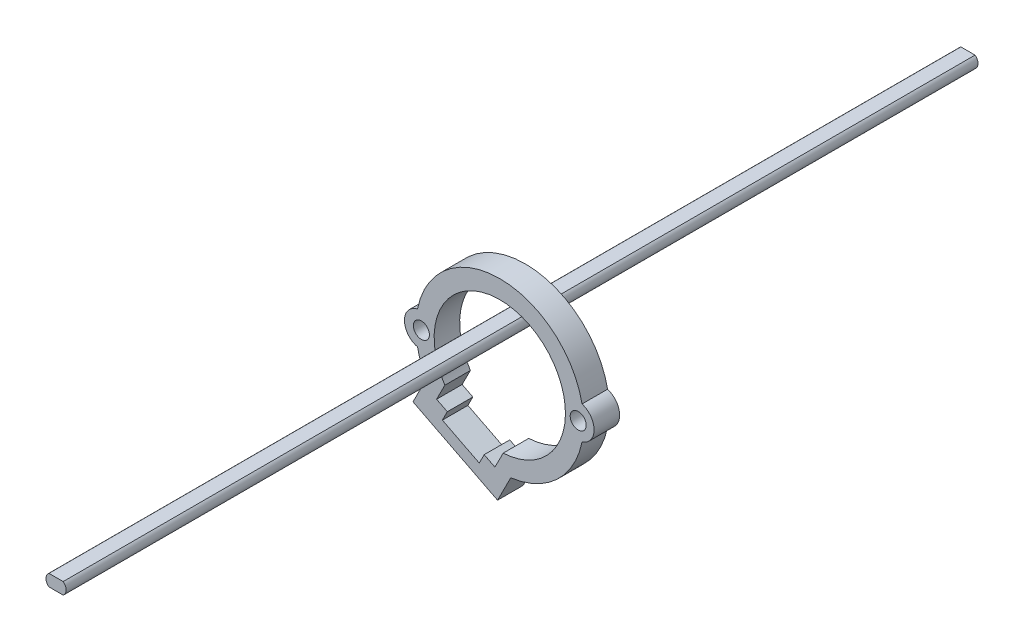
ISO-10303-21;
HEADER;
FILE_DESCRIPTION(('STEP AP214'),'2;1');
FILE_NAME('part.step','',(''),(''),'','','');
FILE_SCHEMA(('AUTOMOTIVE_DESIGN { 1 0 10303 214 1 1 1 1 }'));
ENDSEC;
DATA;
#1=APPLICATION_CONTEXT('core data for automotive mechanical design processes');
#2=APPLICATION_PROTOCOL_DEFINITION('international standard','automotive_design',2000,#1);
#3=PRODUCT_CONTEXT('',#1,'mechanical');
#4=PRODUCT('Part','Part','',(#3));
#5=PRODUCT_RELATED_PRODUCT_CATEGORY('part','',(#4));
#6=PRODUCT_DEFINITION_FORMATION('','',#4);
#7=PRODUCT_DEFINITION_CONTEXT('part definition',#1,'design');
#8=PRODUCT_DEFINITION('design','',#6,#7);
#9=PRODUCT_DEFINITION_SHAPE('','',#8);
#10=(LENGTH_UNIT() NAMED_UNIT(*) SI_UNIT(.MILLI.,.METRE.));
#11=(NAMED_UNIT(*) PLANE_ANGLE_UNIT() SI_UNIT($,.RADIAN.));
#12=(NAMED_UNIT(*) SI_UNIT($,.STERADIAN.) SOLID_ANGLE_UNIT());
#13=UNCERTAINTY_MEASURE_WITH_UNIT(LENGTH_MEASURE(1.E-05),#10,'distance_accuracy_value','');
#14=(GEOMETRIC_REPRESENTATION_CONTEXT(3) GLOBAL_UNCERTAINTY_ASSIGNED_CONTEXT((#13)) GLOBAL_UNIT_ASSIGNED_CONTEXT((#10,
#11,#12)) REPRESENTATION_CONTEXT('',''));
#15=CARTESIAN_POINT('',(0.,0.,0.));
#16=DIRECTION('',(0.,0.,1.));
#17=DIRECTION('',(1.,0.,0.));
#18=AXIS2_PLACEMENT_3D('',#15,#16,#17);
#19=CARTESIAN_POINT('',(-4.4134503803043,7.6,125.));
#20=DIRECTION('',(0.,0.,-1.));
#21=DIRECTION('',(-1.,0.,0.));
#22=AXIS2_PLACEMENT_3D('',#19,#20,#21);
#23=CYLINDRICAL_SURFACE('',#22,2.);
#24=CARTESIAN_POINT('',(-4.4134503803043,7.6,-125.));
#25=DIRECTION('',(0.,0.,1.));
#26=DIRECTION('',(1.,0.,0.));
#27=AXIS2_PLACEMENT_3D('',#24,#25,#26);
#28=CIRCLE('',#27,2.);
#29=CARTESIAN_POINT('',(-5.6,9.21,-125.));
#30=VERTEX_POINT('',#29);
#31=CARTESIAN_POINT('',(-5.6,5.99,-125.));
#32=VERTEX_POINT('',#31);
#33=EDGE_CURVE('E110',#30,#32,#28,.T.);
#34=ORIENTED_EDGE('',*,*,#33,.T.);
#35=DIRECTION('',(0.,0.,-1.));
#36=VECTOR('',#35,1.);
#37=CARTESIAN_POINT('',(-5.6,5.99,125.));
#38=LINE('',#37,#36);
#39=CARTESIAN_POINT('',(-5.6,5.99,125.));
#40=VERTEX_POINT('',#39);
#41=EDGE_CURVE('E12',#40,#32,#38,.T.);
#42=ORIENTED_EDGE('',*,*,#41,.F.);
#43=CARTESIAN_POINT('',(-4.4134503803043,7.6,125.));
#44=DIRECTION('',(0.,0.,1.));
#45=DIRECTION('',(1.,0.,0.));
#46=AXIS2_PLACEMENT_3D('',#43,#44,#45);
#47=CIRCLE('',#46,2.);
#48=CARTESIAN_POINT('',(-5.6,9.21,125.));
#49=VERTEX_POINT('',#48);
#50=EDGE_CURVE('E98',#49,#40,#47,.T.);
#51=ORIENTED_EDGE('',*,*,#50,.F.);
#52=DIRECTION('',(0.,0.,-1.));
#53=VECTOR('',#52,1.);
#54=CARTESIAN_POINT('',(-5.6,9.21,125.));
#55=LINE('',#54,#53);
#56=EDGE_CURVE('E106',#49,#30,#55,.T.);
#57=ORIENTED_EDGE('',*,*,#56,.T.);
#58=EDGE_LOOP('',(#34,#42,#51,#57));
#59=FACE_BOUND('',#58,.T.);
#60=ADVANCED_FACE('F47',(#59),#23,.T.);
#61=CARTESIAN_POINT('',(-1.7,5.99,125.));
#62=DIRECTION('',(0.,1.,0.));
#63=DIRECTION('',(-1.,0.,0.));
#64=AXIS2_PLACEMENT_3D('',#61,#62,#63);
#65=PLANE('',#64);
#66=DIRECTION('',(1.,0.,0.));
#67=VECTOR('',#66,1.);
#68=CARTESIAN_POINT('',(-1.7,5.99,-125.));
#69=LINE('',#68,#67);
#70=CARTESIAN_POINT('',(-1.7,5.99,-125.));
#71=VERTEX_POINT('',#70);
#72=EDGE_CURVE('E102',#32,#71,#69,.T.);
#73=ORIENTED_EDGE('',*,*,#72,.T.);
#74=DIRECTION('',(0.,0.,-1.));
#75=VECTOR('',#74,1.);
#76=CARTESIAN_POINT('',(-1.7,5.99,125.));
#77=LINE('',#76,#75);
#78=CARTESIAN_POINT('',(-1.7,5.99,125.));
#79=VERTEX_POINT('',#78);
#80=EDGE_CURVE('E55',#79,#71,#77,.T.);
#81=ORIENTED_EDGE('',*,*,#80,.F.);
#82=DIRECTION('',(1.,0.,0.));
#83=VECTOR('',#82,1.);
#84=CARTESIAN_POINT('',(-1.7,5.99,125.));
#85=LINE('',#84,#83);
#86=EDGE_CURVE('E93',#40,#79,#85,.T.);
#87=ORIENTED_EDGE('',*,*,#86,.F.);
#88=ORIENTED_EDGE('',*,*,#41,.T.);
#89=EDGE_LOOP('',(#73,#81,#87,#88));
#90=FACE_BOUND('',#89,.T.);
#91=ADVANCED_FACE('F101',(#90),#65,.F.);
#92=CARTESIAN_POINT('',(-2.8865496196957,7.6,125.));
#93=DIRECTION('',(0.,0.,-1.));
#94=DIRECTION('',(-1.,0.,0.));
#95=AXIS2_PLACEMENT_3D('',#92,#93,#94);
#96=CYLINDRICAL_SURFACE('',#95,2.);
#97=CARTESIAN_POINT('',(-2.8865496196957,7.6,-125.));
#98=DIRECTION('',(0.,0.,1.));
#99=DIRECTION('',(-1.,0.,0.));
#100=AXIS2_PLACEMENT_3D('',#97,#98,#99);
#101=CIRCLE('',#100,2.);
#102=CARTESIAN_POINT('',(-1.7,9.21,-125.));
#103=VERTEX_POINT('',#102);
#104=EDGE_CURVE('E80',#71,#103,#101,.T.);
#105=ORIENTED_EDGE('',*,*,#104,.T.);
#106=DIRECTION('',(0.,0.,-1.));
#107=VECTOR('',#106,1.);
#108=CARTESIAN_POINT('',(-1.7,9.21,125.));
#109=LINE('',#108,#107);
#110=CARTESIAN_POINT('',(-1.7,9.21,125.));
#111=VERTEX_POINT('',#110);
#112=EDGE_CURVE('E103',#111,#103,#109,.T.);
#113=ORIENTED_EDGE('',*,*,#112,.F.);
#114=CARTESIAN_POINT('',(-2.8865496196957,7.6,125.));
#115=DIRECTION('',(0.,0.,1.));
#116=DIRECTION('',(-1.,0.,0.));
#117=AXIS2_PLACEMENT_3D('',#114,#115,#116);
#118=CIRCLE('',#117,2.);
#119=EDGE_CURVE('E96',#79,#111,#118,.T.);
#120=ORIENTED_EDGE('',*,*,#119,.F.);
#121=ORIENTED_EDGE('',*,*,#80,.T.);
#122=EDGE_LOOP('',(#105,#113,#120,#121));
#123=FACE_BOUND('',#122,.T.);
#124=ADVANCED_FACE('F104',(#123),#96,.T.);
#125=CARTESIAN_POINT('',(-5.6,9.21,125.));
#126=DIRECTION('',(0.,-1.,0.));
#127=DIRECTION('',(1.,0.,0.));
#128=AXIS2_PLACEMENT_3D('',#125,#126,#127);
#129=PLANE('',#128);
#130=DIRECTION('',(-1.,0.,0.));
#131=VECTOR('',#130,1.);
#132=CARTESIAN_POINT('',(-5.6,9.21,-125.));
#133=LINE('',#132,#131);
#134=EDGE_CURVE('E86',#103,#30,#133,.T.);
#135=ORIENTED_EDGE('',*,*,#134,.T.);
#136=ORIENTED_EDGE('',*,*,#56,.F.);
#137=DIRECTION('',(-1.,0.,0.));
#138=VECTOR('',#137,1.);
#139=CARTESIAN_POINT('',(-5.6,9.21,125.));
#140=LINE('',#139,#138);
#141=EDGE_CURVE('E63',#111,#49,#140,.T.);
#142=ORIENTED_EDGE('',*,*,#141,.F.);
#143=ORIENTED_EDGE('',*,*,#112,.T.);
#144=EDGE_LOOP('',(#135,#136,#142,#143));
#145=FACE_BOUND('',#144,.T.);
#146=ADVANCED_FACE('F117',(#145),#129,.F.);
#147=CARTESIAN_POINT('',(-4.4134503803043,7.6,125.));
#148=DIRECTION('',(0.,0.,1.));
#149=DIRECTION('',(1.,0.,0.));
#150=AXIS2_PLACEMENT_3D('',#147,#148,#149);
#151=PLANE('',#150);
#152=ORIENTED_EDGE('',*,*,#50,.T.);
#153=ORIENTED_EDGE('',*,*,#86,.T.);
#154=ORIENTED_EDGE('',*,*,#119,.T.);
#155=ORIENTED_EDGE('',*,*,#141,.T.);
#156=EDGE_LOOP('',(#152,#153,#154,#155));
#157=FACE_BOUND('',#156,.T.);
#158=ADVANCED_FACE('F94',(#157),#151,.T.);
#159=CARTESIAN_POINT('',(-4.4134503803043,7.6,-125.));
#160=DIRECTION('',(0.,0.,1.));
#161=DIRECTION('',(1.,0.,0.));
#162=AXIS2_PLACEMENT_3D('',#159,#160,#161);
#163=PLANE('',#162);
#164=ORIENTED_EDGE('',*,*,#33,.F.);
#165=ORIENTED_EDGE('',*,*,#134,.F.);
#166=ORIENTED_EDGE('',*,*,#104,.F.);
#167=ORIENTED_EDGE('',*,*,#72,.F.);
#168=EDGE_LOOP('',(#164,#165,#166,#167));
#169=FACE_BOUND('',#168,.T.);
#170=ADVANCED_FACE('F120',(#169),#163,.F.);
#171=CLOSED_SHELL('',(#60,#91,#124,#146,#158,#170));
#172=MANIFOLD_SOLID_BREP('B2',#171);
#173=CARTESIAN_POINT('',(0.,0.,7.));
#174=DIRECTION('',(0.,0.,1.));
#175=DIRECTION('',(1.,0.,0.));
#176=AXIS2_PLACEMENT_3D('',#173,#174,#175);
#177=PLANE('',#176);
#178=CARTESIAN_POINT('',(-21.5,0.,7.));
#179=DIRECTION('',(0.,0.,1.));
#180=DIRECTION('',(1.,0.,0.));
#181=AXIS2_PLACEMENT_3D('',#178,#179,#180);
#182=CIRCLE('',#181,2.2);
#183=CARTESIAN_POINT('',(-19.3,0.,7.));
#184=VERTEX_POINT('',#183);
#185=EDGE_CURVE('E321',#184,#184,#182,.T.);
#186=ORIENTED_EDGE('',*,*,#185,.F.);
#187=EDGE_LOOP('',(#186));
#188=FACE_BOUND('',#187,.T.);
#189=CARTESIAN_POINT('',(21.5,0.,7.));
#190=DIRECTION('',(0.,0.,1.));
#191=DIRECTION('',(1.,0.,0.));
#192=AXIS2_PLACEMENT_3D('',#189,#190,#191);
#193=CIRCLE('',#192,2.2);
#194=CARTESIAN_POINT('',(23.7,0.,7.));
#195=VERTEX_POINT('',#194);
#196=EDGE_CURVE('E328',#195,#195,#193,.T.);
#197=ORIENTED_EDGE('',*,*,#196,.F.);
#198=EDGE_LOOP('',(#197));
#199=FACE_BOUND('',#198,.T.);
#200=CARTESIAN_POINT('',(0.,0.,7.));
#201=DIRECTION('',(0.,0.,1.));
#202=DIRECTION('',(1.,0.,0.));
#203=AXIS2_PLACEMENT_3D('',#200,#201,#202);
#204=CIRCLE('',#203,23.);
#205=CARTESIAN_POINT('',(3.0037414094748,-22.8030159747566,7.));
#206=VERTEX_POINT('',#205);
#207=CARTESIAN_POINT('',(22.5554871372799,-4.49999999999999,7.));
#208=VERTEX_POINT('',#207);
#209=EDGE_CURVE('E45',#206,#208,#204,.T.);
#210=ORIENTED_EDGE('',*,*,#209,.T.);
#211=CARTESIAN_POINT('',(21.1440867670861,0.,7.));
#212=DIRECTION('',(0.,0.,1.));
#213=DIRECTION('',(1.,0.,0.));
#214=AXIS2_PLACEMENT_3D('',#211,#212,#213);
#215=CIRCLE('',#214,4.71614789897257);
#216=CARTESIAN_POINT('',(22.5554871372799,4.49999999999999,7.));
#217=VERTEX_POINT('',#216);
#218=EDGE_CURVE('E333',#208,#217,#215,.T.);
#219=ORIENTED_EDGE('',*,*,#218,.T.);
#220=CARTESIAN_POINT('',(-22.5554871372799,4.5,7.));
#221=VERTEX_POINT('',#220);
#222=EDGE_CURVE('E180',#217,#221,#204,.T.);
#223=ORIENTED_EDGE('',*,*,#222,.T.);
#224=CARTESIAN_POINT('',(-21.5191181486277,0.,7.));
#225=DIRECTION('',(0.,0.,1.));
#226=DIRECTION('',(-1.,0.,0.));
#227=AXIS2_PLACEMENT_3D('',#224,#225,#226);
#228=CIRCLE('',#227,4.61779825031801);
#229=CARTESIAN_POINT('',(-22.5554871372799,-4.5,7.));
#230=VERTEX_POINT('',#229);
#231=EDGE_CURVE('E343',#221,#230,#228,.T.);
#232=ORIENTED_EDGE('',*,*,#231,.T.);
#233=CARTESIAN_POINT('',(-20.1802691852822,-11.0343434607389,7.));
#234=VERTEX_POINT('',#233);
#235=EDGE_CURVE('E181',#230,#234,#204,.T.);
#236=ORIENTED_EDGE('',*,*,#235,.T.);
#237=DIRECTION('',(-0.452641250539145,-0.89169271518296,0.));
#238=VECTOR('',#237,1.);
#239=CARTESIAN_POINT('',(-23.8013991895953,-18.1678851822026,7.));
#240=LINE('',#239,#238);
#241=CARTESIAN_POINT('',(-23.8013991895953,-18.1678851822026,7.));
#242=VERTEX_POINT('',#241);
#243=EDGE_CURVE('E382',#234,#242,#240,.T.);
#244=ORIENTED_EDGE('',*,*,#243,.T.);
#245=DIRECTION('',(0.89169271518296,-0.452641250539144,0.));
#246=VECTOR('',#245,1.);
#247=CARTESIAN_POINT('',(-23.8013991895953,-18.1678851822026,7.));
#248=LINE('',#247,#246);
#249=CARTESIAN_POINT('',(-0.617388594838357,-29.9365576962203,7.));
#250=VERTEX_POINT('',#249);
#251=EDGE_CURVE('E385',#242,#250,#248,.T.);
#252=ORIENTED_EDGE('',*,*,#251,.T.);
#253=DIRECTION('',(0.452641250539144,0.89169271518296,0.));
#254=VECTOR('',#253,1.);
#255=CARTESIAN_POINT('',(-0.617388594838357,-29.9365576962203,7.));
#256=LINE('',#255,#254);
#257=EDGE_CURVE('E388',#250,#206,#256,.T.);
#258=ORIENTED_EDGE('',*,*,#257,.T.);
#259=EDGE_LOOP('',(#210,#219,#223,#232,#236,#244,#252,#258));
#260=FACE_BOUND('',#259,.T.);
#261=DIRECTION('',(0.89169271518296,-0.452641250539144,0.));
#262=VECTOR('',#261,1.);
#263=CARTESIAN_POINT('',(-5.6290336746241,-23.6155416865999,7.));
#264=LINE('',#263,#262);
#265=CARTESIAN_POINT('',(-15.7408290647989,-18.4825899054861,7.));
#266=VERTEX_POINT('',#265);
#267=CARTESIAN_POINT('',(-5.6290336746241,-23.6155416865999,7.));
#268=VERTEX_POINT('',#267);
#269=EDGE_CURVE('E298',#266,#268,#264,.T.);
#270=ORIENTED_EDGE('',*,*,#269,.F.);
#271=DIRECTION('',(-0.452641250539142,-0.891692715182961,0.));
#272=VECTOR('',#271,1.);
#273=CARTESIAN_POINT('',(-15.7408290647989,-18.4825899054861,7.));
#274=LINE('',#273,#272);
#275=CARTESIAN_POINT('',(-14.3829053131814,-15.8075117599372,7.));
#276=VERTEX_POINT('',#275);
#277=EDGE_CURVE('E287',#276,#266,#274,.T.);
#278=ORIENTED_EDGE('',*,*,#277,.F.);
#279=DIRECTION('',(0.89169271518296,-0.452641250539144,0.));
#280=VECTOR('',#279,1.);
#281=CARTESIAN_POINT('',(-17.3254912732852,-14.313795633158,7.));
#282=LINE('',#281,#280);
#283=CARTESIAN_POINT('',(-17.3254912732852,-14.313795633158,7.));
#284=VERTEX_POINT('',#283);
#285=EDGE_CURVE('E359',#284,#276,#282,.T.);
#286=ORIENTED_EDGE('',*,*,#285,.F.);
#287=DIRECTION('',(-0.452641250539143,-0.891692715182961,0.));
#288=VECTOR('',#287,1.);
#289=CARTESIAN_POINT('',(-15.0622850205895,-9.85533205724319,7.));
#290=LINE('',#289,#288);
#291=CARTESIAN_POINT('',(-15.0622850205895,-9.85533205724319,7.));
#292=VERTEX_POINT('',#291);
#293=EDGE_CURVE('E355',#292,#284,#290,.T.);
#294=ORIENTED_EDGE('',*,*,#293,.F.);
#295=CARTESIAN_POINT('',(0.,0.,7.));
#296=DIRECTION('',(0.,0.,1.));
#297=DIRECTION('',(1.,0.,0.));
#298=AXIS2_PLACEMENT_3D('',#295,#296,#297);
#299=CIRCLE('',#298,18.);
#300=CARTESIAN_POINT('',(0.934682289792814,-17.9757160919154,7.));
#301=VERTEX_POINT('',#300);
#302=EDGE_CURVE('E410',#301,#292,#299,.T.);
#303=ORIENTED_EDGE('',*,*,#302,.F.);
#304=DIRECTION('',(0.452641250539144,0.89169271518296,0.));
#305=VECTOR('',#304,1.);
#306=CARTESIAN_POINT('',(-1.32852396290291,-22.4341796678302,7.));
#307=LINE('',#306,#305);
#308=CARTESIAN_POINT('',(-1.32852396290291,-22.4341796678302,7.));
#309=VERTEX_POINT('',#308);
#310=EDGE_CURVE('E361',#309,#301,#307,.T.);
#311=ORIENTED_EDGE('',*,*,#310,.F.);
#312=CARTESIAN_POINT('',(-4.27110992300667,-20.9404635410511,7.));
#313=VERTEX_POINT('',#312);
#314=EDGE_CURVE('E357',#313,#309,#282,.T.);
#315=ORIENTED_EDGE('',*,*,#314,.F.);
#316=DIRECTION('',(0.452641250539143,0.891692715182961,0.));
#317=VECTOR('',#316,1.);
#318=CARTESIAN_POINT('',(-4.27110992300667,-20.9404635410511,7.));
#319=LINE('',#318,#317);
#320=EDGE_CURVE('E188',#268,#313,#319,.T.);
#321=ORIENTED_EDGE('',*,*,#320,.F.);
#322=EDGE_LOOP('',(#270,#278,#286,#294,#303,#311,#315,#321));
#323=FACE_BOUND('',#322,.T.);
#324=ADVANCED_FACE('F171',(#188,#199,#260,#323),#177,.T.);
#325=CARTESIAN_POINT('',(0.,0.,0.));
#326=DIRECTION('',(0.,0.,1.));
#327=DIRECTION('',(1.,0.,0.));
#328=AXIS2_PLACEMENT_3D('',#325,#326,#327);
#329=PLANE('',#328);
#330=CARTESIAN_POINT('',(0.,0.,0.));
#331=DIRECTION('',(0.,0.,1.));
#332=DIRECTION('',(1.,0.,0.));
#333=AXIS2_PLACEMENT_3D('',#330,#331,#332);
#334=CIRCLE('',#333,23.);
#335=CARTESIAN_POINT('',(3.0037414094748,-22.8030159747566,0.));
#336=VERTEX_POINT('',#335);
#337=CARTESIAN_POINT('',(22.5554871372799,-4.49999999999999,0.));
#338=VERTEX_POINT('',#337);
#339=EDGE_CURVE('E175',#336,#338,#334,.T.);
#340=ORIENTED_EDGE('',*,*,#339,.F.);
#341=DIRECTION('',(0.452641250539144,0.89169271518296,0.));
#342=VECTOR('',#341,1.);
#343=CARTESIAN_POINT('',(-0.617388594838357,-29.9365576962203,0.));
#344=LINE('',#343,#342);
#345=CARTESIAN_POINT('',(-0.617388594838357,-29.9365576962203,0.));
#346=VERTEX_POINT('',#345);
#347=EDGE_CURVE('E386',#346,#336,#344,.T.);
#348=ORIENTED_EDGE('',*,*,#347,.F.);
#349=DIRECTION('',(0.89169271518296,-0.452641250539144,0.));
#350=VECTOR('',#349,1.);
#351=CARTESIAN_POINT('',(-23.8013991895953,-18.1678851822026,0.));
#352=LINE('',#351,#350);
#353=CARTESIAN_POINT('',(-23.8013991895953,-18.1678851822026,0.));
#354=VERTEX_POINT('',#353);
#355=EDGE_CURVE('E394',#354,#346,#352,.T.);
#356=ORIENTED_EDGE('',*,*,#355,.F.);
#357=DIRECTION('',(-0.452641250539145,-0.89169271518296,0.));
#358=VECTOR('',#357,1.);
#359=CARTESIAN_POINT('',(-23.8013991895953,-18.1678851822026,0.));
#360=LINE('',#359,#358);
#361=CARTESIAN_POINT('',(-20.1802691852822,-11.0343434607389,0.));
#362=VERTEX_POINT('',#361);
#363=EDGE_CURVE('E381',#362,#354,#360,.T.);
#364=ORIENTED_EDGE('',*,*,#363,.F.);
#365=CARTESIAN_POINT('',(-22.5554871372799,-4.5,0.));
#366=VERTEX_POINT('',#365);
#367=EDGE_CURVE('E413',#366,#362,#334,.T.);
#368=ORIENTED_EDGE('',*,*,#367,.F.);
#369=CARTESIAN_POINT('',(-21.5191181486277,0.,0.));
#370=DIRECTION('',(0.,0.,1.));
#371=DIRECTION('',(-1.,0.,0.));
#372=AXIS2_PLACEMENT_3D('',#369,#370,#371);
#373=CIRCLE('',#372,4.61779825031801);
#374=CARTESIAN_POINT('',(-22.5554871372799,4.5,0.));
#375=VERTEX_POINT('',#374);
#376=EDGE_CURVE('E342',#375,#366,#373,.T.);
#377=ORIENTED_EDGE('',*,*,#376,.F.);
#378=CARTESIAN_POINT('',(22.5554871372799,4.5,0.));
#379=VERTEX_POINT('',#378);
#380=EDGE_CURVE('E496',#379,#375,#334,.T.);
#381=ORIENTED_EDGE('',*,*,#380,.F.);
#382=CARTESIAN_POINT('',(21.1440867670861,0.,0.));
#383=DIRECTION('',(0.,0.,1.));
#384=DIRECTION('',(1.,0.,0.));
#385=AXIS2_PLACEMENT_3D('',#382,#383,#384);
#386=CIRCLE('',#385,4.71614789897257);
#387=EDGE_CURVE('E324',#338,#379,#386,.T.);
#388=ORIENTED_EDGE('',*,*,#387,.F.);
#389=EDGE_LOOP('',(#340,#348,#356,#364,#368,#377,#381,#388));
#390=FACE_BOUND('',#389,.T.);
#391=CARTESIAN_POINT('',(21.5,0.,0.));
#392=DIRECTION('',(0.,0.,1.));
#393=DIRECTION('',(1.,0.,0.));
#394=AXIS2_PLACEMENT_3D('',#391,#392,#393);
#395=CIRCLE('',#394,2.2);
#396=CARTESIAN_POINT('',(23.7,0.,0.));
#397=VERTEX_POINT('',#396);
#398=EDGE_CURVE('E305',#397,#397,#395,.T.);
#399=ORIENTED_EDGE('',*,*,#398,.T.);
#400=EDGE_LOOP('',(#399));
#401=FACE_BOUND('',#400,.T.);
#402=CARTESIAN_POINT('',(-21.5,0.,0.));
#403=DIRECTION('',(0.,0.,1.));
#404=DIRECTION('',(1.,0.,0.));
#405=AXIS2_PLACEMENT_3D('',#402,#403,#404);
#406=CIRCLE('',#405,2.2);
#407=CARTESIAN_POINT('',(-19.3,0.,0.));
#408=VERTEX_POINT('',#407);
#409=EDGE_CURVE('E325',#408,#408,#406,.T.);
#410=ORIENTED_EDGE('',*,*,#409,.T.);
#411=EDGE_LOOP('',(#410));
#412=FACE_BOUND('',#411,.T.);
#413=DIRECTION('',(-0.452641250539142,-0.891692715182961,0.));
#414=VECTOR('',#413,1.);
#415=CARTESIAN_POINT('',(-15.7408290647989,-18.4825899054861,0.));
#416=LINE('',#415,#414);
#417=CARTESIAN_POINT('',(-14.3829053131814,-15.8075117599372,0.));
#418=VERTEX_POINT('',#417);
#419=CARTESIAN_POINT('',(-15.7408290647989,-18.4825899054861,0.));
#420=VERTEX_POINT('',#419);
#421=EDGE_CURVE('E312',#418,#420,#416,.T.);
#422=ORIENTED_EDGE('',*,*,#421,.T.);
#423=DIRECTION('',(0.89169271518296,-0.452641250539144,0.));
#424=VECTOR('',#423,1.);
#425=CARTESIAN_POINT('',(-5.6290336746241,-23.6155416865999,0.));
#426=LINE('',#425,#424);
#427=CARTESIAN_POINT('',(-5.6290336746241,-23.6155416865999,0.));
#428=VERTEX_POINT('',#427);
#429=EDGE_CURVE('E304',#420,#428,#426,.T.);
#430=ORIENTED_EDGE('',*,*,#429,.T.);
#431=DIRECTION('',(0.452641250539143,0.891692715182961,0.));
#432=VECTOR('',#431,1.);
#433=CARTESIAN_POINT('',(-4.27110992300667,-20.9404635410511,0.));
#434=LINE('',#433,#432);
#435=CARTESIAN_POINT('',(-4.27110992300667,-20.9404635410511,0.));
#436=VERTEX_POINT('',#435);
#437=EDGE_CURVE('E299',#428,#436,#434,.T.);
#438=ORIENTED_EDGE('',*,*,#437,.T.);
#439=DIRECTION('',(0.89169271518296,-0.452641250539144,0.));
#440=VECTOR('',#439,1.);
#441=CARTESIAN_POINT('',(-17.3254912732852,-14.313795633158,0.));
#442=LINE('',#441,#440);
#443=CARTESIAN_POINT('',(-1.32852396290291,-22.4341796678302,0.));
#444=VERTEX_POINT('',#443);
#445=EDGE_CURVE('E366',#436,#444,#442,.T.);
#446=ORIENTED_EDGE('',*,*,#445,.T.);
#447=DIRECTION('',(0.452641250539144,0.89169271518296,0.));
#448=VECTOR('',#447,1.);
#449=CARTESIAN_POINT('',(-1.32852396290291,-22.4341796678302,0.));
#450=LINE('',#449,#448);
#451=CARTESIAN_POINT('',(0.934682289792814,-17.9757160919154,0.));
#452=VERTEX_POINT('',#451);
#453=EDGE_CURVE('E358',#444,#452,#450,.T.);
#454=ORIENTED_EDGE('',*,*,#453,.T.);
#455=CARTESIAN_POINT('',(0.,0.,0.));
#456=DIRECTION('',(0.,0.,1.));
#457=DIRECTION('',(1.,0.,0.));
#458=AXIS2_PLACEMENT_3D('',#455,#456,#457);
#459=CIRCLE('',#458,18.);
#460=CARTESIAN_POINT('',(-15.0622850205895,-9.85533205724319,0.));
#461=VERTEX_POINT('',#460);
#462=EDGE_CURVE('E409',#452,#461,#459,.T.);
#463=ORIENTED_EDGE('',*,*,#462,.T.);
#464=DIRECTION('',(-0.452641250539143,-0.891692715182961,0.));
#465=VECTOR('',#464,1.);
#466=CARTESIAN_POINT('',(-15.0622850205895,-9.85533205724319,0.));
#467=LINE('',#466,#465);
#468=CARTESIAN_POINT('',(-17.3254912732852,-14.313795633158,0.));
#469=VERTEX_POINT('',#468);
#470=EDGE_CURVE('E354',#461,#469,#467,.T.);
#471=ORIENTED_EDGE('',*,*,#470,.T.);
#472=EDGE_CURVE('E367',#469,#418,#442,.T.);
#473=ORIENTED_EDGE('',*,*,#472,.T.);
#474=EDGE_LOOP('',(#422,#430,#438,#446,#454,#463,#471,#473));
#475=FACE_BOUND('',#474,.T.);
#476=ADVANCED_FACE('F417',(#390,#401,#412,#475),#329,.F.);
#477=CARTESIAN_POINT('',(-17.3254912732852,-14.313795633158,7.));
#478=DIRECTION('',(0.452641250539144,0.89169271518296,0.));
#479=DIRECTION('',(-0.89169271518296,0.452641250539144,0.));
#480=AXIS2_PLACEMENT_3D('',#477,#478,#479);
#481=PLANE('',#480);
#482=ORIENTED_EDGE('',*,*,#285,.T.);
#483=DIRECTION('',(0.,0.,-1.));
#484=VECTOR('',#483,1.);
#485=CARTESIAN_POINT('',(-14.3829053131814,-15.8075117599372,7.));
#486=LINE('',#485,#484);
#487=EDGE_CURVE('E293',#276,#418,#486,.T.);
#488=ORIENTED_EDGE('',*,*,#487,.T.);
#489=ORIENTED_EDGE('',*,*,#472,.F.);
#490=DIRECTION('',(0.,0.,-1.));
#491=VECTOR('',#490,1.);
#492=CARTESIAN_POINT('',(-17.3254912732852,-14.313795633158,7.));
#493=LINE('',#492,#491);
#494=EDGE_CURVE('E376',#284,#469,#493,.T.);
#495=ORIENTED_EDGE('',*,*,#494,.F.);
#496=EDGE_LOOP('',(#482,#488,#489,#495));
#497=FACE_BOUND('',#496,.T.);
#498=ADVANCED_FACE('F429',(#497),#481,.T.);
#499=ORIENTED_EDGE('',*,*,#445,.F.);
#500=DIRECTION('',(0.,0.,-1.));
#501=VECTOR('',#500,1.);
#502=CARTESIAN_POINT('',(-4.27110992300667,-20.9404635410511,7.));
#503=LINE('',#502,#501);
#504=EDGE_CURVE('E318',#313,#436,#503,.T.);
#505=ORIENTED_EDGE('',*,*,#504,.F.);
#506=ORIENTED_EDGE('',*,*,#314,.T.);
#507=DIRECTION('',(0.,0.,-1.));
#508=VECTOR('',#507,1.);
#509=CARTESIAN_POINT('',(-1.32852396290291,-22.4341796678302,7.));
#510=LINE('',#509,#508);
#511=EDGE_CURVE('E373',#309,#444,#510,.T.);
#512=ORIENTED_EDGE('',*,*,#511,.T.);
#513=EDGE_LOOP('',(#499,#505,#506,#512));
#514=FACE_BOUND('',#513,.T.);
#515=ADVANCED_FACE('F434',(#514),#481,.T.);
#516=CARTESIAN_POINT('',(0.,0.,7.));
#517=DIRECTION('',(0.,0.,-1.));
#518=DIRECTION('',(-1.,0.,0.));
#519=AXIS2_PLACEMENT_3D('',#516,#517,#518);
#520=CYLINDRICAL_SURFACE('',#519,23.);
#521=DIRECTION('',(0.,0.,-1.));
#522=VECTOR('',#521,1.);
#523=CARTESIAN_POINT('',(22.5554871372799,-4.5,7.));
#524=LINE('',#523,#522);
#525=EDGE_CURVE('E339',#208,#338,#524,.T.);
#526=ORIENTED_EDGE('',*,*,#525,.F.);
#527=ORIENTED_EDGE('',*,*,#209,.F.);
#528=DIRECTION('',(0.,0.,-1.));
#529=VECTOR('',#528,1.);
#530=CARTESIAN_POINT('',(3.0037414094748,-22.8030159747566,7.));
#531=LINE('',#530,#529);
#532=EDGE_CURVE('E400',#206,#336,#531,.T.);
#533=ORIENTED_EDGE('',*,*,#532,.T.);
#534=ORIENTED_EDGE('',*,*,#339,.T.);
#535=EDGE_LOOP('',(#526,#527,#533,#534));
#536=FACE_BOUND('',#535,.T.);
#537=ADVANCED_FACE('F173',(#536),#520,.T.);
#538=DIRECTION('',(0.,0.,-1.));
#539=VECTOR('',#538,1.);
#540=CARTESIAN_POINT('',(22.5554871372799,4.5,7.));
#541=LINE('',#540,#539);
#542=EDGE_CURVE('E335',#217,#379,#541,.T.);
#543=ORIENTED_EDGE('',*,*,#542,.T.);
#544=ORIENTED_EDGE('',*,*,#380,.T.);
#545=DIRECTION('',(0.,0.,-1.));
#546=VECTOR('',#545,1.);
#547=CARTESIAN_POINT('',(-22.5554871372799,4.5,7.));
#548=LINE('',#547,#546);
#549=EDGE_CURVE('E351',#221,#375,#548,.T.);
#550=ORIENTED_EDGE('',*,*,#549,.F.);
#551=ORIENTED_EDGE('',*,*,#222,.F.);
#552=EDGE_LOOP('',(#543,#544,#550,#551));
#553=FACE_BOUND('',#552,.T.);
#554=ADVANCED_FACE('F481',(#553),#520,.T.);
#555=DIRECTION('',(0.,0.,-1.));
#556=VECTOR('',#555,1.);
#557=CARTESIAN_POINT('',(-22.5554871372799,-4.5,7.));
#558=LINE('',#557,#556);
#559=EDGE_CURVE('E346',#230,#366,#558,.T.);
#560=ORIENTED_EDGE('',*,*,#559,.T.);
#561=ORIENTED_EDGE('',*,*,#367,.T.);
#562=DIRECTION('',(0.,0.,-1.));
#563=VECTOR('',#562,1.);
#564=CARTESIAN_POINT('',(-20.1802691852821,-11.0343434607389,7.));
#565=LINE('',#564,#563);
#566=EDGE_CURVE('E391',#234,#362,#565,.T.);
#567=ORIENTED_EDGE('',*,*,#566,.F.);
#568=ORIENTED_EDGE('',*,*,#235,.F.);
#569=EDGE_LOOP('',(#560,#561,#567,#568));
#570=FACE_BOUND('',#569,.T.);
#571=ADVANCED_FACE('F464',(#570),#520,.T.);
#572=CARTESIAN_POINT('',(0.,0.,7.));
#573=DIRECTION('',(0.,0.,-1.));
#574=DIRECTION('',(-1.,0.,0.));
#575=AXIS2_PLACEMENT_3D('',#572,#573,#574);
#576=CYLINDRICAL_SURFACE('',#575,18.);
#577=ORIENTED_EDGE('',*,*,#302,.T.);
#578=DIRECTION('',(0.,0.,-1.));
#579=VECTOR('',#578,1.);
#580=CARTESIAN_POINT('',(-15.0622850205895,-9.85533205724319,7.));
#581=LINE('',#580,#579);
#582=EDGE_CURVE('E378',#292,#461,#581,.T.);
#583=ORIENTED_EDGE('',*,*,#582,.T.);
#584=ORIENTED_EDGE('',*,*,#462,.F.);
#585=DIRECTION('',(0.,0.,-1.));
#586=VECTOR('',#585,1.);
#587=CARTESIAN_POINT('',(0.934682289792814,-17.9757160919154,7.));
#588=LINE('',#587,#586);
#589=EDGE_CURVE('E363',#301,#452,#588,.T.);
#590=ORIENTED_EDGE('',*,*,#589,.F.);
#591=EDGE_LOOP('',(#577,#583,#584,#590));
#592=FACE_BOUND('',#591,.T.);
#593=ADVANCED_FACE('F421',(#592),#576,.F.);
#594=CARTESIAN_POINT('',(-23.8013991895953,-18.1678851822026,7.));
#595=DIRECTION('',(0.89169271518296,-0.452641250539145,0.));
#596=DIRECTION('',(0.452641250539145,0.89169271518296,0.));
#597=AXIS2_PLACEMENT_3D('',#594,#595,#596);
#598=PLANE('',#597);
#599=ORIENTED_EDGE('',*,*,#363,.T.);
#600=DIRECTION('',(0.,0.,-1.));
#601=VECTOR('',#600,1.);
#602=CARTESIAN_POINT('',(-23.8013991895953,-18.1678851822026,7.));
#603=LINE('',#602,#601);
#604=EDGE_CURVE('E406',#242,#354,#603,.T.);
#605=ORIENTED_EDGE('',*,*,#604,.F.);
#606=ORIENTED_EDGE('',*,*,#243,.F.);
#607=ORIENTED_EDGE('',*,*,#566,.T.);
#608=EDGE_LOOP('',(#599,#605,#606,#607));
#609=FACE_BOUND('',#608,.T.);
#610=ADVANCED_FACE('F463',(#609),#598,.F.);
#611=CARTESIAN_POINT('',(-23.8013991895953,-18.1678851822026,7.));
#612=DIRECTION('',(0.452641250539144,0.89169271518296,0.));
#613=DIRECTION('',(-0.89169271518296,0.452641250539144,0.));
#614=AXIS2_PLACEMENT_3D('',#611,#612,#613);
#615=PLANE('',#614);
#616=ORIENTED_EDGE('',*,*,#355,.T.);
#617=DIRECTION('',(0.,0.,-1.));
#618=VECTOR('',#617,1.);
#619=CARTESIAN_POINT('',(-0.617388594838357,-29.9365576962203,7.));
#620=LINE('',#619,#618);
#621=EDGE_CURVE('E403',#250,#346,#620,.T.);
#622=ORIENTED_EDGE('',*,*,#621,.F.);
#623=ORIENTED_EDGE('',*,*,#251,.F.);
#624=ORIENTED_EDGE('',*,*,#604,.T.);
#625=EDGE_LOOP('',(#616,#622,#623,#624));
#626=FACE_BOUND('',#625,.T.);
#627=ADVANCED_FACE('F467',(#626),#615,.F.);
#628=CARTESIAN_POINT('',(-0.617388594838357,-29.9365576962203,7.));
#629=DIRECTION('',(-0.89169271518296,0.452641250539144,0.));
#630=DIRECTION('',(-0.452641250539144,-0.89169271518296,0.));
#631=AXIS2_PLACEMENT_3D('',#628,#629,#630);
#632=PLANE('',#631);
#633=ORIENTED_EDGE('',*,*,#347,.T.);
#634=ORIENTED_EDGE('',*,*,#532,.F.);
#635=ORIENTED_EDGE('',*,*,#257,.F.);
#636=ORIENTED_EDGE('',*,*,#621,.T.);
#637=EDGE_LOOP('',(#633,#634,#635,#636));
#638=FACE_BOUND('',#637,.T.);
#639=ADVANCED_FACE('F448',(#638),#632,.F.);
#640=CARTESIAN_POINT('',(-15.0622850205895,-9.85533205724319,7.));
#641=DIRECTION('',(0.891692715182961,-0.452641250539143,0.));
#642=DIRECTION('',(0.452641250539143,0.891692715182961,0.));
#643=AXIS2_PLACEMENT_3D('',#640,#641,#642);
#644=PLANE('',#643);
#645=ORIENTED_EDGE('',*,*,#470,.F.);
#646=ORIENTED_EDGE('',*,*,#582,.F.);
#647=ORIENTED_EDGE('',*,*,#293,.T.);
#648=ORIENTED_EDGE('',*,*,#494,.T.);
#649=EDGE_LOOP('',(#645,#646,#647,#648));
#650=FACE_BOUND('',#649,.T.);
#651=ADVANCED_FACE('F425',(#650),#644,.T.);
#652=CARTESIAN_POINT('',(-1.32852396290291,-22.4341796678302,7.));
#653=DIRECTION('',(-0.89169271518296,0.452641250539144,0.));
#654=DIRECTION('',(-0.452641250539144,-0.89169271518296,0.));
#655=AXIS2_PLACEMENT_3D('',#652,#653,#654);
#656=PLANE('',#655);
#657=ORIENTED_EDGE('',*,*,#453,.F.);
#658=ORIENTED_EDGE('',*,*,#511,.F.);
#659=ORIENTED_EDGE('',*,*,#310,.T.);
#660=ORIENTED_EDGE('',*,*,#589,.T.);
#661=EDGE_LOOP('',(#657,#658,#659,#660));
#662=FACE_BOUND('',#661,.T.);
#663=ADVANCED_FACE('F437',(#662),#656,.T.);
#664=CARTESIAN_POINT('',(-21.5191181486277,0.,7.));
#665=DIRECTION('',(0.,0.,-1.));
#666=DIRECTION('',(-1.,0.,0.));
#667=AXIS2_PLACEMENT_3D('',#664,#665,#666);
#668=CYLINDRICAL_SURFACE('',#667,4.61779825031801);
#669=ORIENTED_EDGE('',*,*,#376,.T.);
#670=ORIENTED_EDGE('',*,*,#559,.F.);
#671=ORIENTED_EDGE('',*,*,#231,.F.);
#672=ORIENTED_EDGE('',*,*,#549,.T.);
#673=EDGE_LOOP('',(#669,#670,#671,#672));
#674=FACE_BOUND('',#673,.T.);
#675=ADVANCED_FACE('F439',(#674),#668,.T.);
#676=CARTESIAN_POINT('',(21.1440867670861,0.,7.));
#677=DIRECTION('',(0.,0.,-1.));
#678=DIRECTION('',(-1.,0.,0.));
#679=AXIS2_PLACEMENT_3D('',#676,#677,#678);
#680=CYLINDRICAL_SURFACE('',#679,4.71614789897257);
#681=ORIENTED_EDGE('',*,*,#387,.T.);
#682=ORIENTED_EDGE('',*,*,#542,.F.);
#683=ORIENTED_EDGE('',*,*,#218,.F.);
#684=ORIENTED_EDGE('',*,*,#525,.T.);
#685=EDGE_LOOP('',(#681,#682,#683,#684));
#686=FACE_BOUND('',#685,.T.);
#687=ADVANCED_FACE('F445',(#686),#680,.T.);
#688=CARTESIAN_POINT('',(21.5,0.,7.));
#689=DIRECTION('',(0.,0.,-1.));
#690=DIRECTION('',(-1.,0.,0.));
#691=AXIS2_PLACEMENT_3D('',#688,#689,#690);
#692=CYLINDRICAL_SURFACE('',#691,2.2);
#693=ORIENTED_EDGE('',*,*,#196,.T.);
#694=EDGE_LOOP('',(#693));
#695=FACE_BOUND('',#694,.T.);
#696=ORIENTED_EDGE('',*,*,#398,.F.);
#697=EDGE_LOOP('',(#696));
#698=FACE_BOUND('',#697,.T.);
#699=ADVANCED_FACE('F509',(#695,#698),#692,.F.);
#700=CARTESIAN_POINT('',(-21.5,0.,7.));
#701=DIRECTION('',(0.,0.,-1.));
#702=DIRECTION('',(-1.,0.,0.));
#703=AXIS2_PLACEMENT_3D('',#700,#701,#702);
#704=CYLINDRICAL_SURFACE('',#703,2.2);
#705=ORIENTED_EDGE('',*,*,#185,.T.);
#706=EDGE_LOOP('',(#705));
#707=FACE_BOUND('',#706,.T.);
#708=ORIENTED_EDGE('',*,*,#409,.F.);
#709=EDGE_LOOP('',(#708));
#710=FACE_BOUND('',#709,.T.);
#711=ADVANCED_FACE('F514',(#707,#710),#704,.F.);
#712=CARTESIAN_POINT('',(-15.7408290647989,-18.4825899054861,7.));
#713=DIRECTION('',(0.891692715182961,-0.452641250539142,0.));
#714=DIRECTION('',(0.452641250539142,0.891692715182961,0.));
#715=AXIS2_PLACEMENT_3D('',#712,#713,#714);
#716=PLANE('',#715);
#717=ORIENTED_EDGE('',*,*,#421,.F.);
#718=ORIENTED_EDGE('',*,*,#487,.F.);
#719=ORIENTED_EDGE('',*,*,#277,.T.);
#720=DIRECTION('',(0.,0.,-1.));
#721=VECTOR('',#720,1.);
#722=CARTESIAN_POINT('',(-15.7408290647989,-18.4825899054861,7.));
#723=LINE('',#722,#721);
#724=EDGE_CURVE('E290',#266,#420,#723,.T.);
#725=ORIENTED_EDGE('',*,*,#724,.T.);
#726=EDGE_LOOP('',(#717,#718,#719,#725));
#727=FACE_BOUND('',#726,.T.);
#728=ADVANCED_FACE('F289',(#727),#716,.T.);
#729=CARTESIAN_POINT('',(-5.6290336746241,-23.6155416865999,7.));
#730=DIRECTION('',(0.452641250539144,0.89169271518296,0.));
#731=DIRECTION('',(-0.89169271518296,0.452641250539144,0.));
#732=AXIS2_PLACEMENT_3D('',#729,#730,#731);
#733=PLANE('',#732);
#734=ORIENTED_EDGE('',*,*,#429,.F.);
#735=ORIENTED_EDGE('',*,*,#724,.F.);
#736=ORIENTED_EDGE('',*,*,#269,.T.);
#737=DIRECTION('',(0.,0.,-1.));
#738=VECTOR('',#737,1.);
#739=CARTESIAN_POINT('',(-5.6290336746241,-23.6155416865999,7.));
#740=LINE('',#739,#738);
#741=EDGE_CURVE('E306',#268,#428,#740,.T.);
#742=ORIENTED_EDGE('',*,*,#741,.T.);
#743=EDGE_LOOP('',(#734,#735,#736,#742));
#744=FACE_BOUND('',#743,.T.);
#745=ADVANCED_FACE('F302',(#744),#733,.T.);
#746=CARTESIAN_POINT('',(-4.27110992300667,-20.9404635410511,7.));
#747=DIRECTION('',(-0.891692715182961,0.452641250539143,0.));
#748=DIRECTION('',(-0.452641250539143,-0.891692715182961,0.));
#749=AXIS2_PLACEMENT_3D('',#746,#747,#748);
#750=PLANE('',#749);
#751=ORIENTED_EDGE('',*,*,#437,.F.);
#752=ORIENTED_EDGE('',*,*,#741,.F.);
#753=ORIENTED_EDGE('',*,*,#320,.T.);
#754=ORIENTED_EDGE('',*,*,#504,.T.);
#755=EDGE_LOOP('',(#751,#752,#753,#754));
#756=FACE_BOUND('',#755,.T.);
#757=ADVANCED_FACE('F525',(#756),#750,.T.);
#758=CLOSED_SHELL('',(#324,#476,#498,#515,#537,#554,#571,#593,#610,#627,#639,#651,#663,#675,
#687,#699,#711,#728,#745,#757));
#759=MANIFOLD_SOLID_BREP('B6',#758);
#760=ADVANCED_BREP_SHAPE_REPRESENTATION('',(#18,#172,#759),#14);
#761=SHAPE_DEFINITION_REPRESENTATION(#9,#760);
ENDSEC;
END-ISO-10303-21;
